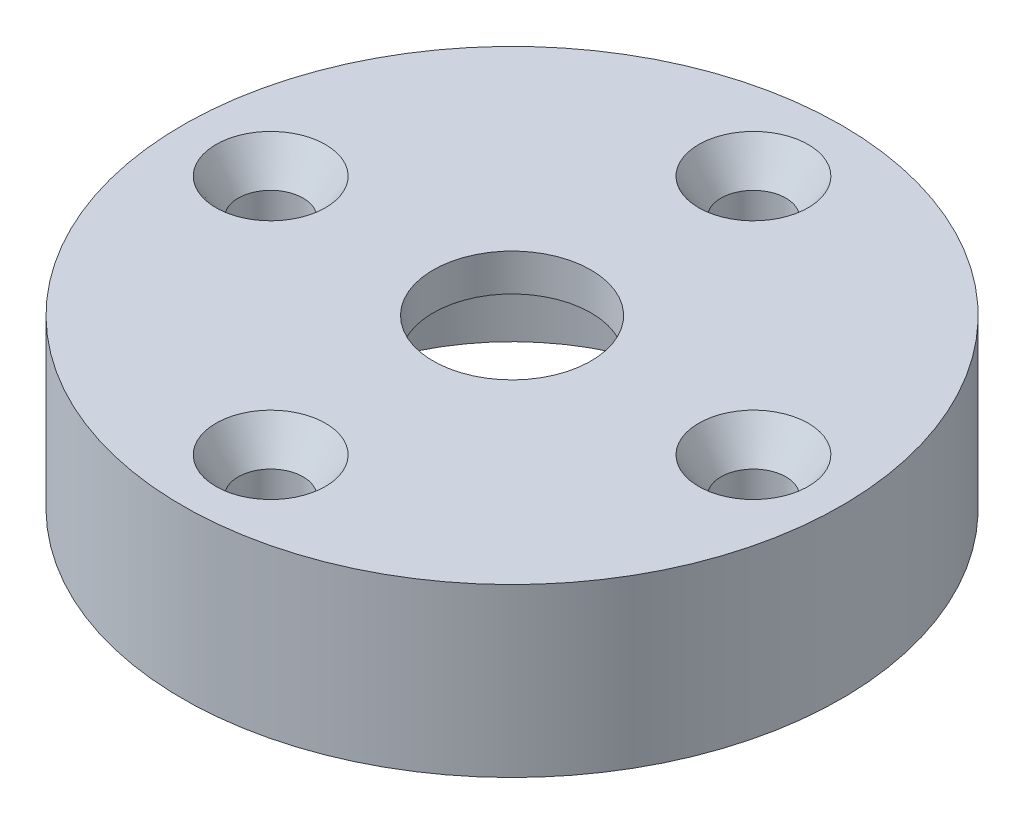
ISO-10303-21;
HEADER;
FILE_DESCRIPTION(('STEP AP214'),'2;1');
FILE_NAME('part.step','',(''),(''),'','','');
FILE_SCHEMA(('AUTOMOTIVE_DESIGN { 1 0 10303 214 1 1 1 1 }'));
ENDSEC;
DATA;
#1=APPLICATION_CONTEXT('core data for automotive mechanical design processes');
#2=APPLICATION_PROTOCOL_DEFINITION('international standard','automotive_design',2000,#1);
#3=PRODUCT_CONTEXT('',#1,'mechanical');
#4=PRODUCT('Part','Part','',(#3));
#5=PRODUCT_RELATED_PRODUCT_CATEGORY('part','',(#4));
#6=PRODUCT_DEFINITION_FORMATION('','',#4);
#7=PRODUCT_DEFINITION_CONTEXT('part definition',#1,'design');
#8=PRODUCT_DEFINITION('design','',#6,#7);
#9=PRODUCT_DEFINITION_SHAPE('','',#8);
#10=(LENGTH_UNIT() NAMED_UNIT(*) SI_UNIT(.MILLI.,.METRE.));
#11=(NAMED_UNIT(*) PLANE_ANGLE_UNIT() SI_UNIT($,.RADIAN.));
#12=(NAMED_UNIT(*) SI_UNIT($,.STERADIAN.) SOLID_ANGLE_UNIT());
#13=UNCERTAINTY_MEASURE_WITH_UNIT(LENGTH_MEASURE(1.E-05),#10,'distance_accuracy_value','');
#14=(GEOMETRIC_REPRESENTATION_CONTEXT(3) GLOBAL_UNCERTAINTY_ASSIGNED_CONTEXT((#13)) GLOBAL_UNIT_ASSIGNED_CONTEXT((#10,
#11,#12)) REPRESENTATION_CONTEXT('',''));
#15=CARTESIAN_POINT('',(0.,0.,0.));
#16=DIRECTION('',(0.,0.,1.));
#17=DIRECTION('',(1.,0.,0.));
#18=AXIS2_PLACEMENT_3D('',#15,#16,#17);
#19=CARTESIAN_POINT('',(0.,0.,0.));
#20=DIRECTION('',(0.,-1.,0.));
#21=DIRECTION('',(0.,0.,-1.));
#22=AXIS2_PLACEMENT_3D('',#19,#20,#21);
#23=CYLINDRICAL_SURFACE('',#22,11.);
#24=CARTESIAN_POINT('',(0.,7.,0.));
#25=DIRECTION('',(0.,-1.,0.));
#26=DIRECTION('',(0.,0.,-1.));
#27=AXIS2_PLACEMENT_3D('',#24,#25,#26);
#28=CIRCLE('',#27,11.);
#29=CARTESIAN_POINT('',(0.,7.,-11.));
#30=VERTEX_POINT('',#29);
#31=EDGE_CURVE('E84',#30,#30,#28,.T.);
#32=ORIENTED_EDGE('',*,*,#31,.F.);
#33=EDGE_LOOP('',(#32));
#34=FACE_BOUND('',#33,.T.);
#35=CARTESIAN_POINT('',(0.,0.,0.));
#36=DIRECTION('',(0.,-1.,0.));
#37=DIRECTION('',(0.,0.,-1.));
#38=AXIS2_PLACEMENT_3D('',#35,#36,#37);
#39=CIRCLE('',#38,11.);
#40=CARTESIAN_POINT('',(0.,0.,-11.));
#41=VERTEX_POINT('',#40);
#42=EDGE_CURVE('E69',#41,#41,#39,.T.);
#43=ORIENTED_EDGE('',*,*,#42,.T.);
#44=EDGE_LOOP('',(#43));
#45=FACE_BOUND('',#44,.T.);
#46=ADVANCED_FACE('F36',(#34,#45),#23,.F.);
#47=CARTESIAN_POINT('',(-11.,0.,0.));
#48=DIRECTION('',(0.,1.,0.));
#49=DIRECTION('',(0.,0.,1.));
#50=AXIS2_PLACEMENT_3D('',#47,#48,#49);
#51=PLANE('',#50);
#52=CARTESIAN_POINT('',(0.,0.,-13.));
#53=DIRECTION('',(0.,1.,0.));
#54=DIRECTION('',(0.,0.,1.));
#55=AXIS2_PLACEMENT_3D('',#52,#53,#54);
#56=CIRCLE('',#55,1.75);
#57=CARTESIAN_POINT('',(0.,0.,-11.25));
#58=VERTEX_POINT('',#57);
#59=EDGE_CURVE('E87',#58,#58,#56,.F.);
#60=ORIENTED_EDGE('',*,*,#59,.F.);
#61=EDGE_LOOP('',(#60));
#62=FACE_BOUND('',#61,.T.);
#63=CARTESIAN_POINT('',(13.,0.,0.));
#64=DIRECTION('',(0.,1.,0.));
#65=DIRECTION('',(0.,0.,1.));
#66=AXIS2_PLACEMENT_3D('',#63,#64,#65);
#67=CIRCLE('',#66,1.75000000000046);
#68=CARTESIAN_POINT('',(13.,0.,1.75000000000046));
#69=VERTEX_POINT('',#68);
#70=EDGE_CURVE('E94',#69,#69,#67,.F.);
#71=ORIENTED_EDGE('',*,*,#70,.F.);
#72=EDGE_LOOP('',(#71));
#73=FACE_BOUND('',#72,.T.);
#74=CARTESIAN_POINT('',(0.,0.,13.));
#75=DIRECTION('',(0.,1.,0.));
#76=DIRECTION('',(0.,0.,1.));
#77=AXIS2_PLACEMENT_3D('',#74,#75,#76);
#78=CIRCLE('',#77,1.7500000000007);
#79=CARTESIAN_POINT('',(0.,0.,14.7500000000007));
#80=VERTEX_POINT('',#79);
#81=EDGE_CURVE('E91',#80,#80,#78,.F.);
#82=ORIENTED_EDGE('',*,*,#81,.F.);
#83=EDGE_LOOP('',(#82));
#84=FACE_BOUND('',#83,.T.);
#85=CARTESIAN_POINT('',(-13.,0.,0.));
#86=DIRECTION('',(0.,1.,0.));
#87=DIRECTION('',(0.,0.,1.));
#88=AXIS2_PLACEMENT_3D('',#85,#86,#87);
#89=CIRCLE('',#88,1.75000000000024);
#90=CARTESIAN_POINT('',(-13.,0.,1.75000000000024));
#91=VERTEX_POINT('',#90);
#92=EDGE_CURVE('E88',#91,#91,#89,.F.);
#93=ORIENTED_EDGE('',*,*,#92,.F.);
#94=EDGE_LOOP('',(#93));
#95=FACE_BOUND('',#94,.T.);
#96=ORIENTED_EDGE('',*,*,#42,.F.);
#97=EDGE_LOOP('',(#96));
#98=FACE_BOUND('',#97,.T.);
#99=CARTESIAN_POINT('',(0.,0.,0.));
#100=DIRECTION('',(0.,-1.,0.));
#101=DIRECTION('',(0.,0.,-1.));
#102=AXIS2_PLACEMENT_3D('',#99,#100,#101);
#103=CIRCLE('',#102,17.75);
#104=CARTESIAN_POINT('',(0.,0.,-17.75));
#105=VERTEX_POINT('',#104);
#106=EDGE_CURVE('E72',#105,#105,#103,.T.);
#107=ORIENTED_EDGE('',*,*,#106,.T.);
#108=EDGE_LOOP('',(#107));
#109=FACE_BOUND('',#108,.T.);
#110=ADVANCED_FACE('F102',(#62,#73,#84,#95,#98,#109),#51,.F.);
#111=CARTESIAN_POINT('',(0.,0.,0.));
#112=DIRECTION('',(0.,-1.,0.));
#113=DIRECTION('',(0.,0.,-1.));
#114=AXIS2_PLACEMENT_3D('',#111,#112,#113);
#115=CYLINDRICAL_SURFACE('',#114,17.75);
#116=ORIENTED_EDGE('',*,*,#106,.F.);
#117=EDGE_LOOP('',(#116));
#118=FACE_BOUND('',#117,.T.);
#119=CARTESIAN_POINT('',(0.,9.,0.));
#120=DIRECTION('',(0.,-1.,0.));
#121=DIRECTION('',(0.,0.,-1.));
#122=AXIS2_PLACEMENT_3D('',#119,#120,#121);
#123=CIRCLE('',#122,17.75);
#124=CARTESIAN_POINT('',(0.,9.,-17.75));
#125=VERTEX_POINT('',#124);
#126=EDGE_CURVE('E75',#125,#125,#123,.T.);
#127=ORIENTED_EDGE('',*,*,#126,.T.);
#128=EDGE_LOOP('',(#127));
#129=FACE_BOUND('',#128,.T.);
#130=ADVANCED_FACE('F105',(#118,#129),#115,.T.);
#131=CARTESIAN_POINT('',(-17.75,9.,0.));
#132=DIRECTION('',(0.,-1.,0.));
#133=DIRECTION('',(0.,0.,-1.));
#134=AXIS2_PLACEMENT_3D('',#131,#132,#133);
#135=PLANE('',#134);
#136=CARTESIAN_POINT('',(0.,9.,13.));
#137=DIRECTION('',(0.,-1.,0.));
#138=DIRECTION('',(0.,0.,-1.));
#139=AXIS2_PLACEMENT_3D('',#136,#137,#138);
#140=CIRCLE('',#139,2.9500000000007);
#141=CARTESIAN_POINT('',(0.,9.,15.9500000000007));
#142=VERTEX_POINT('',#141);
#143=EDGE_CURVE('E52',#142,#142,#140,.T.);
#144=ORIENTED_EDGE('',*,*,#143,.T.);
#145=EDGE_LOOP('',(#144));
#146=FACE_BOUND('',#145,.T.);
#147=CARTESIAN_POINT('',(13.,9.,0.));
#148=DIRECTION('',(0.,-1.,0.));
#149=DIRECTION('',(0.,0.,-1.));
#150=AXIS2_PLACEMENT_3D('',#147,#148,#149);
#151=CIRCLE('',#150,2.95000000000047);
#152=CARTESIAN_POINT('',(13.,9.,-2.95000000000047));
#153=VERTEX_POINT('',#152);
#154=EDGE_CURVE('E57',#153,#153,#151,.T.);
#155=ORIENTED_EDGE('',*,*,#154,.T.);
#156=EDGE_LOOP('',(#155));
#157=FACE_BOUND('',#156,.T.);
#158=CARTESIAN_POINT('',(0.,9.,-13.));
#159=DIRECTION('',(0.,-1.,0.));
#160=DIRECTION('',(0.,0.,-1.));
#161=AXIS2_PLACEMENT_3D('',#158,#159,#160);
#162=CIRCLE('',#161,2.95);
#163=CARTESIAN_POINT('',(0.,9.,-10.05));
#164=VERTEX_POINT('',#163);
#165=EDGE_CURVE('E60',#164,#164,#162,.T.);
#166=ORIENTED_EDGE('',*,*,#165,.T.);
#167=EDGE_LOOP('',(#166));
#168=FACE_BOUND('',#167,.T.);
#169=CARTESIAN_POINT('',(-13.,9.,0.));
#170=DIRECTION('',(0.,-1.,0.));
#171=DIRECTION('',(0.,0.,-1.));
#172=AXIS2_PLACEMENT_3D('',#169,#170,#171);
#173=CIRCLE('',#172,2.95000000000025);
#174=CARTESIAN_POINT('',(-13.,9.,-2.95000000000025));
#175=VERTEX_POINT('',#174);
#176=EDGE_CURVE('E63',#175,#175,#173,.T.);
#177=ORIENTED_EDGE('',*,*,#176,.T.);
#178=EDGE_LOOP('',(#177));
#179=FACE_BOUND('',#178,.T.);
#180=ORIENTED_EDGE('',*,*,#126,.F.);
#181=EDGE_LOOP('',(#180));
#182=FACE_BOUND('',#181,.T.);
#183=CARTESIAN_POINT('',(0.,9.,0.));
#184=DIRECTION('',(0.,-1.,0.));
#185=DIRECTION('',(0.,0.,-1.));
#186=AXIS2_PLACEMENT_3D('',#183,#184,#185);
#187=CIRCLE('',#186,4.25);
#188=CARTESIAN_POINT('',(0.,9.,-4.25));
#189=VERTEX_POINT('',#188);
#190=EDGE_CURVE('E78',#189,#189,#187,.T.);
#191=ORIENTED_EDGE('',*,*,#190,.T.);
#192=EDGE_LOOP('',(#191));
#193=FACE_BOUND('',#192,.T.);
#194=ADVANCED_FACE('F119',(#146,#157,#168,#179,#182,#193),#135,.F.);
#195=CARTESIAN_POINT('',(0.,0.,0.));
#196=DIRECTION('',(0.,-1.,0.));
#197=DIRECTION('',(0.,0.,-1.));
#198=AXIS2_PLACEMENT_3D('',#195,#196,#197);
#199=CYLINDRICAL_SURFACE('',#198,4.25);
#200=ORIENTED_EDGE('',*,*,#190,.F.);
#201=EDGE_LOOP('',(#200));
#202=FACE_BOUND('',#201,.T.);
#203=CARTESIAN_POINT('',(0.,7.,0.));
#204=DIRECTION('',(0.,-1.,0.));
#205=DIRECTION('',(0.,0.,-1.));
#206=AXIS2_PLACEMENT_3D('',#203,#204,#205);
#207=CIRCLE('',#206,4.25);
#208=CARTESIAN_POINT('',(0.,7.,-4.25));
#209=VERTEX_POINT('',#208);
#210=EDGE_CURVE('E81',#209,#209,#207,.T.);
#211=ORIENTED_EDGE('',*,*,#210,.T.);
#212=EDGE_LOOP('',(#211));
#213=FACE_BOUND('',#212,.T.);
#214=ADVANCED_FACE('F125',(#202,#213),#199,.F.);
#215=CARTESIAN_POINT('',(-4.25,7.,0.));
#216=DIRECTION('',(0.,1.,0.));
#217=DIRECTION('',(0.,0.,1.));
#218=AXIS2_PLACEMENT_3D('',#215,#216,#217);
#219=PLANE('',#218);
#220=ORIENTED_EDGE('',*,*,#210,.F.);
#221=EDGE_LOOP('',(#220));
#222=FACE_BOUND('',#221,.T.);
#223=ORIENTED_EDGE('',*,*,#31,.T.);
#224=EDGE_LOOP('',(#223));
#225=FACE_BOUND('',#224,.T.);
#226=ADVANCED_FACE('F132',(#222,#225),#219,.F.);
#227=CARTESIAN_POINT('',(-13.,-4.94974746830781,0.));
#228=DIRECTION('',(0.,1.,0.));
#229=DIRECTION('',(0.,0.,1.));
#230=AXIS2_PLACEMENT_3D('',#227,#228,#229);
#231=CYLINDRICAL_SURFACE('',#230,1.75000000000024);
#232=CARTESIAN_POINT('',(-13.,7.09999999999998,0.));
#233=DIRECTION('',(0.,-1.,0.));
#234=DIRECTION('',(0.,0.,-1.));
#235=AXIS2_PLACEMENT_3D('',#232,#233,#234);
#236=CIRCLE('',#235,1.75000000000024);
#237=CARTESIAN_POINT('',(-13.,7.09999999999998,-1.75000000000024));
#238=VERTEX_POINT('',#237);
#239=EDGE_CURVE('E10',#238,#238,#236,.F.);
#240=ORIENTED_EDGE('',*,*,#239,.T.);
#241=EDGE_LOOP('',(#240));
#242=FACE_BOUND('',#241,.T.);
#243=ORIENTED_EDGE('',*,*,#92,.T.);
#244=EDGE_LOOP('',(#243));
#245=FACE_BOUND('',#244,.T.);
#246=ADVANCED_FACE('F138',(#242,#245),#231,.F.);
#247=CARTESIAN_POINT('',(0.,-4.94974746830781,13.));
#248=DIRECTION('',(0.,1.,0.));
#249=DIRECTION('',(0.,0.,1.));
#250=AXIS2_PLACEMENT_3D('',#247,#248,#249);
#251=CYLINDRICAL_SURFACE('',#250,1.7500000000007);
#252=CARTESIAN_POINT('',(0.,7.09999999999999,13.));
#253=DIRECTION('',(0.,-1.,0.));
#254=DIRECTION('',(0.,0.,-1.));
#255=AXIS2_PLACEMENT_3D('',#252,#253,#254);
#256=CIRCLE('',#255,1.7500000000007);
#257=CARTESIAN_POINT('',(0.,7.09999999999999,14.7500000000007));
#258=VERTEX_POINT('',#257);
#259=EDGE_CURVE('E66',#258,#258,#256,.F.);
#260=ORIENTED_EDGE('',*,*,#259,.T.);
#261=EDGE_LOOP('',(#260));
#262=FACE_BOUND('',#261,.T.);
#263=ORIENTED_EDGE('',*,*,#81,.T.);
#264=EDGE_LOOP('',(#263));
#265=FACE_BOUND('',#264,.T.);
#266=ADVANCED_FACE('F213',(#262,#265),#251,.F.);
#267=CARTESIAN_POINT('',(13.,-4.94974746830781,0.));
#268=DIRECTION('',(0.,1.,0.));
#269=DIRECTION('',(0.,0.,1.));
#270=AXIS2_PLACEMENT_3D('',#267,#268,#269);
#271=CYLINDRICAL_SURFACE('',#270,1.75000000000046);
#272=CARTESIAN_POINT('',(13.,7.09999999999997,0.));
#273=DIRECTION('',(0.,-1.,0.));
#274=DIRECTION('',(0.,0.,-1.));
#275=AXIS2_PLACEMENT_3D('',#272,#273,#274);
#276=CIRCLE('',#275,1.75000000000046);
#277=CARTESIAN_POINT('',(13.,7.09999999999997,-1.75000000000045));
#278=VERTEX_POINT('',#277);
#279=EDGE_CURVE('E48',#278,#278,#276,.F.);
#280=ORIENTED_EDGE('',*,*,#279,.T.);
#281=EDGE_LOOP('',(#280));
#282=FACE_BOUND('',#281,.T.);
#283=ORIENTED_EDGE('',*,*,#70,.T.);
#284=EDGE_LOOP('',(#283));
#285=FACE_BOUND('',#284,.T.);
#286=ADVANCED_FACE('F204',(#282,#285),#271,.F.);
#287=CARTESIAN_POINT('',(0.,-4.94974746830781,-13.));
#288=DIRECTION('',(0.,1.,0.));
#289=DIRECTION('',(0.,0.,1.));
#290=AXIS2_PLACEMENT_3D('',#287,#288,#289);
#291=CYLINDRICAL_SURFACE('',#290,1.75);
#292=CARTESIAN_POINT('',(0.,7.09999999999999,-13.));
#293=DIRECTION('',(0.,-1.,0.));
#294=DIRECTION('',(0.,0.,-1.));
#295=AXIS2_PLACEMENT_3D('',#292,#293,#294);
#296=CIRCLE('',#295,1.75);
#297=CARTESIAN_POINT('',(0.,7.09999999999999,-11.25));
#298=VERTEX_POINT('',#297);
#299=EDGE_CURVE('E44',#298,#298,#296,.F.);
#300=ORIENTED_EDGE('',*,*,#299,.T.);
#301=EDGE_LOOP('',(#300));
#302=FACE_BOUND('',#301,.T.);
#303=ORIENTED_EDGE('',*,*,#59,.T.);
#304=EDGE_LOOP('',(#303));
#305=FACE_BOUND('',#304,.T.);
#306=ADVANCED_FACE('F100',(#302,#305),#291,.F.);
#307=CARTESIAN_POINT('',(0.,7.09999999999999,13.));
#308=DIRECTION('',(0.,1.,0.));
#309=DIRECTION('',(0.,0.,1.));
#310=AXIS2_PLACEMENT_3D('',#307,#308,#309);
#311=CONICAL_SURFACE('',#310,1.7500000000007,0.563316261491968);
#312=CARTESIAN_POINT('',(0.,9.,15.9500000000007));
#313=CARTESIAN_POINT('',(0.,8.98020833333334,15.9375000000007));
#314=CARTESIAN_POINT('',(0.,8.96041666666667,15.9250000000007));
#315=CARTESIAN_POINT('',(0.,8.92083333333334,15.9000000000007));
#316=CARTESIAN_POINT('',(0.,8.90104166666667,15.8875000000007));
#317=CARTESIAN_POINT('',(0.,8.86145833333333,15.8625000000007));
#318=CARTESIAN_POINT('',(0.,8.84166666666667,15.8500000000007));
#319=CARTESIAN_POINT('',(0.,8.80208333333334,15.8250000000007));
#320=CARTESIAN_POINT('',(0.,8.78229166666667,15.8125000000007));
#321=CARTESIAN_POINT('',(0.,8.74270833333333,15.7875000000007));
#322=CARTESIAN_POINT('',(0.,8.72291666666667,15.7750000000007));
#323=CARTESIAN_POINT('',(0.,8.68333333333334,15.7500000000007));
#324=CARTESIAN_POINT('',(0.,8.66354166666667,15.7375000000007));
#325=CARTESIAN_POINT('',(0.,8.62395833333333,15.7125000000007));
#326=CARTESIAN_POINT('',(0.,8.60416666666667,15.7000000000007));
#327=CARTESIAN_POINT('',(0.,8.56458333333333,15.6750000000007));
#328=CARTESIAN_POINT('',(0.,8.54479166666667,15.6625000000007));
#329=CARTESIAN_POINT('',(0.,8.50520833333333,15.6375000000007));
#330=CARTESIAN_POINT('',(0.,8.48541666666667,15.6250000000007));
#331=CARTESIAN_POINT('',(0.,8.44583333333333,15.6000000000007));
#332=CARTESIAN_POINT('',(0.,8.42604166666666,15.5875000000007));
#333=CARTESIAN_POINT('',(0.,8.38645833333333,15.5625000000007));
#334=CARTESIAN_POINT('',(0.,8.36666666666667,15.5500000000007));
#335=CARTESIAN_POINT('',(0.,8.32708333333333,15.5250000000007));
#336=CARTESIAN_POINT('',(0.,8.30729166666666,15.5125000000007));
#337=CARTESIAN_POINT('',(0.,8.26770833333333,15.4875000000007));
#338=CARTESIAN_POINT('',(0.,8.24791666666666,15.4750000000007));
#339=CARTESIAN_POINT('',(0.,8.20833333333333,15.4500000000007));
#340=CARTESIAN_POINT('',(0.,8.18854166666666,15.4375000000007));
#341=CARTESIAN_POINT('',(0.,8.14895833333333,15.4125000000007));
#342=CARTESIAN_POINT('',(0.,8.12916666666666,15.4000000000007));
#343=CARTESIAN_POINT('',(0.,8.08958333333333,15.3750000000007));
#344=CARTESIAN_POINT('',(0.,8.06979166666666,15.3625000000007));
#345=CARTESIAN_POINT('',(0.,8.03020833333333,15.3375000000007));
#346=CARTESIAN_POINT('',(0.,8.01041666666666,15.3250000000007));
#347=CARTESIAN_POINT('',(0.,7.97083333333333,15.3000000000007));
#348=CARTESIAN_POINT('',(0.,7.95104166666666,15.2875000000007));
#349=CARTESIAN_POINT('',(0.,7.91145833333333,15.2625000000007));
#350=CARTESIAN_POINT('',(0.,7.89166666666666,15.2500000000007));
#351=CARTESIAN_POINT('',(0.,7.85208333333333,15.2250000000007));
#352=CARTESIAN_POINT('',(0.,7.83229166666666,15.2125000000007));
#353=CARTESIAN_POINT('',(0.,7.79270833333333,15.1875000000007));
#354=CARTESIAN_POINT('',(0.,7.77291666666666,15.1750000000007));
#355=CARTESIAN_POINT('',(0.,7.73333333333333,15.1500000000007));
#356=CARTESIAN_POINT('',(0.,7.71354166666666,15.1375000000007));
#357=CARTESIAN_POINT('',(0.,7.67395833333333,15.1125000000007));
#358=CARTESIAN_POINT('',(0.,7.65416666666666,15.1000000000007));
#359=CARTESIAN_POINT('',(0.,7.61458333333333,15.0750000000007));
#360=CARTESIAN_POINT('',(0.,7.59479166666666,15.0625000000007));
#361=CARTESIAN_POINT('',(0.,7.55520833333333,15.0375000000007));
#362=CARTESIAN_POINT('',(0.,7.53541666666666,15.0250000000007));
#363=CARTESIAN_POINT('',(0.,7.49583333333333,15.0000000000007));
#364=CARTESIAN_POINT('',(0.,7.47604166666666,14.9875000000007));
#365=CARTESIAN_POINT('',(0.,7.43645833333333,14.9625000000007));
#366=CARTESIAN_POINT('',(0.,7.41666666666666,14.9500000000007));
#367=CARTESIAN_POINT('',(0.,7.37708333333333,14.9250000000007));
#368=CARTESIAN_POINT('',(0.,7.35729166666666,14.9125000000007));
#369=CARTESIAN_POINT('',(0.,7.31770833333332,14.8875000000007));
#370=CARTESIAN_POINT('',(0.,7.29791666666666,14.8750000000007));
#371=CARTESIAN_POINT('',(0.,7.25833333333332,14.8500000000007));
#372=CARTESIAN_POINT('',(0.,7.23854166666666,14.8375000000007));
#373=CARTESIAN_POINT('',(0.,7.19895833333332,14.8125000000007));
#374=CARTESIAN_POINT('',(0.,7.17916666666666,14.8000000000007));
#375=CARTESIAN_POINT('',(0.,7.13958333333332,14.7750000000007));
#376=CARTESIAN_POINT('',(0.,7.11979166666666,14.7625000000007));
#377=CARTESIAN_POINT('',(0.,7.09999999999999,14.7500000000007));
#378=B_SPLINE_CURVE_WITH_KNOTS('',3,(#312,#313,#314,#315,#316,#317,#318,#319,#320,#321,#322,
#323,#324,#325,#326,#327,#328,#329,#330,#331,#332,#333,#334,#335,#336,#337,#338,#339,#340,#341,
#342,#343,#344,#345,#346,#347,#348,#349,#350,#351,#352,#353,#354,#355,#356,#357,#358,#359,#360,
#361,#362,#363,#364,#365,#366,#367,#368,#369,#370,#371,#372,#373,#374,#375,#376,#377),
.UNSPECIFIED.,.F.,.F.,(4,2,2,2,2,2,2,2,2,2,2,2,2,2,2,2,2,2,2,2,2,2,2,2,2,2,2,2,2,2,2,2,4),(0.,
0.0702256407945132,0.140451281589028,0.210676922383541,0.280902563178055,0.35112820397257,
0.421353844767083,0.491579485561596,0.561805126356109,0.632030767150624,0.702256407945138,
0.772482048739651,0.842707689534165,0.912933330328678,0.983158971123192,1.05338461191771,
1.12361025271222,1.19383589350673,1.26406153430125,1.33428717509576,1.40451281589027,
1.47473845668479,1.5449640974793,1.61518973827381,1.68541537906833,1.75564101986284,
1.82586666065736,1.89609230145187,1.96631794224638,2.0365435830409,2.10676922383541,
2.17699486462993,2.24722050542444),.UNSPECIFIED.);
#379=EDGE_CURVE('BSEAM149',#142,#258,#378,.T.);
#380=ORIENTED_EDGE('',*,*,#143,.F.);
#381=ORIENTED_EDGE('',*,*,#259,.F.);
#382=ORIENTED_EDGE('',*,*,#379,.T.);
#383=ORIENTED_EDGE('',*,*,#379,.F.);
#384=EDGE_LOOP('',(#380,#382,#381,#383));
#385=FACE_BOUND('',#384,.T.);
#386=ADVANCED_FACE('F149',(#385),#311,.F.);
#387=CARTESIAN_POINT('',(13.,7.09999999999997,0.));
#388=DIRECTION('',(0.,1.,0.));
#389=DIRECTION('',(0.,0.,1.));
#390=AXIS2_PLACEMENT_3D('',#387,#388,#389);
#391=CONICAL_SURFACE('',#390,1.75000000000046,0.563316261491968);
#392=ORIENTED_EDGE('',*,*,#154,.F.);
#393=EDGE_LOOP('',(#392));
#394=FACE_BOUND('',#393,.T.);
#395=ORIENTED_EDGE('',*,*,#279,.F.);
#396=EDGE_LOOP('',(#395));
#397=FACE_BOUND('',#396,.T.);
#398=ADVANCED_FACE('F155',(#394,#397),#391,.F.);
#399=CARTESIAN_POINT('',(0.,7.09999999999999,-13.));
#400=DIRECTION('',(0.,1.,0.));
#401=DIRECTION('',(0.,0.,1.));
#402=AXIS2_PLACEMENT_3D('',#399,#400,#401);
#403=CONICAL_SURFACE('',#402,1.75,0.563316261491966);
#404=CARTESIAN_POINT('',(0.,9.,-10.05));
#405=CARTESIAN_POINT('',(0.,8.98020833333334,-10.0625));
#406=CARTESIAN_POINT('',(0.,8.96041666666667,-10.075));
#407=CARTESIAN_POINT('',(0.,8.92083333333334,-10.1));
#408=CARTESIAN_POINT('',(0.,8.90104166666667,-10.1125));
#409=CARTESIAN_POINT('',(0.,8.86145833333333,-10.1375));
#410=CARTESIAN_POINT('',(0.,8.84166666666667,-10.15));
#411=CARTESIAN_POINT('',(0.,8.80208333333334,-10.175));
#412=CARTESIAN_POINT('',(0.,8.78229166666667,-10.1875));
#413=CARTESIAN_POINT('',(0.,8.74270833333333,-10.2125));
#414=CARTESIAN_POINT('',(0.,8.72291666666667,-10.225));
#415=CARTESIAN_POINT('',(0.,8.68333333333334,-10.25));
#416=CARTESIAN_POINT('',(0.,8.66354166666667,-10.2625));
#417=CARTESIAN_POINT('',(0.,8.62395833333333,-10.2875));
#418=CARTESIAN_POINT('',(0.,8.60416666666667,-10.3));
#419=CARTESIAN_POINT('',(0.,8.56458333333333,-10.325));
#420=CARTESIAN_POINT('',(0.,8.54479166666667,-10.3375));
#421=CARTESIAN_POINT('',(0.,8.50520833333333,-10.3625));
#422=CARTESIAN_POINT('',(0.,8.48541666666667,-10.375));
#423=CARTESIAN_POINT('',(0.,8.44583333333333,-10.4));
#424=CARTESIAN_POINT('',(0.,8.42604166666666,-10.4125));
#425=CARTESIAN_POINT('',(0.,8.38645833333333,-10.4375));
#426=CARTESIAN_POINT('',(0.,8.36666666666667,-10.45));
#427=CARTESIAN_POINT('',(0.,8.32708333333333,-10.475));
#428=CARTESIAN_POINT('',(0.,8.30729166666666,-10.4875));
#429=CARTESIAN_POINT('',(0.,8.26770833333333,-10.5125));
#430=CARTESIAN_POINT('',(0.,8.24791666666666,-10.525));
#431=CARTESIAN_POINT('',(0.,8.20833333333333,-10.55));
#432=CARTESIAN_POINT('',(0.,8.18854166666666,-10.5625));
#433=CARTESIAN_POINT('',(0.,8.14895833333333,-10.5875));
#434=CARTESIAN_POINT('',(0.,8.12916666666666,-10.6));
#435=CARTESIAN_POINT('',(0.,8.08958333333333,-10.625));
#436=CARTESIAN_POINT('',(0.,8.06979166666666,-10.6375));
#437=CARTESIAN_POINT('',(0.,8.03020833333333,-10.6625));
#438=CARTESIAN_POINT('',(0.,8.01041666666666,-10.675));
#439=CARTESIAN_POINT('',(0.,7.97083333333333,-10.7));
#440=CARTESIAN_POINT('',(0.,7.95104166666666,-10.7125));
#441=CARTESIAN_POINT('',(0.,7.91145833333333,-10.7375));
#442=CARTESIAN_POINT('',(0.,7.89166666666666,-10.75));
#443=CARTESIAN_POINT('',(0.,7.85208333333333,-10.775));
#444=CARTESIAN_POINT('',(0.,7.83229166666666,-10.7875));
#445=CARTESIAN_POINT('',(0.,7.79270833333333,-10.8125));
#446=CARTESIAN_POINT('',(0.,7.77291666666666,-10.825));
#447=CARTESIAN_POINT('',(0.,7.73333333333333,-10.85));
#448=CARTESIAN_POINT('',(0.,7.71354166666666,-10.8625));
#449=CARTESIAN_POINT('',(0.,7.67395833333333,-10.8875));
#450=CARTESIAN_POINT('',(0.,7.65416666666666,-10.9));
#451=CARTESIAN_POINT('',(0.,7.61458333333333,-10.925));
#452=CARTESIAN_POINT('',(0.,7.59479166666666,-10.9375));
#453=CARTESIAN_POINT('',(0.,7.55520833333333,-10.9625));
#454=CARTESIAN_POINT('',(0.,7.53541666666666,-10.975));
#455=CARTESIAN_POINT('',(0.,7.49583333333333,-11.));
#456=CARTESIAN_POINT('',(0.,7.47604166666666,-11.0125));
#457=CARTESIAN_POINT('',(0.,7.43645833333333,-11.0375));
#458=CARTESIAN_POINT('',(0.,7.41666666666666,-11.05));
#459=CARTESIAN_POINT('',(0.,7.37708333333333,-11.075));
#460=CARTESIAN_POINT('',(0.,7.35729166666666,-11.0875));
#461=CARTESIAN_POINT('',(0.,7.31770833333332,-11.1125));
#462=CARTESIAN_POINT('',(0.,7.29791666666666,-11.125));
#463=CARTESIAN_POINT('',(0.,7.25833333333332,-11.15));
#464=CARTESIAN_POINT('',(0.,7.23854166666666,-11.1625));
#465=CARTESIAN_POINT('',(0.,7.19895833333332,-11.1875));
#466=CARTESIAN_POINT('',(0.,7.17916666666666,-11.2));
#467=CARTESIAN_POINT('',(0.,7.13958333333332,-11.225));
#468=CARTESIAN_POINT('',(0.,7.11979166666666,-11.2375));
#469=CARTESIAN_POINT('',(0.,7.09999999999999,-11.25));
#470=B_SPLINE_CURVE_WITH_KNOTS('',3,(#404,#405,#406,#407,#408,#409,#410,#411,#412,#413,#414,
#415,#416,#417,#418,#419,#420,#421,#422,#423,#424,#425,#426,#427,#428,#429,#430,#431,#432,#433,
#434,#435,#436,#437,#438,#439,#440,#441,#442,#443,#444,#445,#446,#447,#448,#449,#450,#451,#452,
#453,#454,#455,#456,#457,#458,#459,#460,#461,#462,#463,#464,#465,#466,#467,#468,#469),
.UNSPECIFIED.,.F.,.F.,(4,2,2,2,2,2,2,2,2,2,2,2,2,2,2,2,2,2,2,2,2,2,2,2,2,2,2,2,2,2,2,2,4),(0.,
0.0702256407945132,0.140451281589026,0.210676922383541,0.280902563178054,0.351128203972568,
0.421353844767081,0.491579485561594,0.561805126356108,0.632030767150622,0.702256407945136,
0.772482048739649,0.842707689534162,0.912933330328676,0.983158971123191,1.0533846119177,
1.12361025271222,1.19383589350673,1.26406153430124,1.33428717509576,1.40451281589027,
1.47473845668478,1.5449640974793,1.61518973827381,1.68541537906833,1.75564101986284,
1.82586666065735,1.89609230145187,1.96631794224638,2.03654358304089,2.10676922383541,
2.17699486462992,2.24722050542443),.UNSPECIFIED.);
#471=EDGE_CURVE('BSEAM161',#164,#298,#470,.T.);
#472=ORIENTED_EDGE('',*,*,#165,.F.);
#473=ORIENTED_EDGE('',*,*,#299,.F.);
#474=ORIENTED_EDGE('',*,*,#471,.T.);
#475=ORIENTED_EDGE('',*,*,#471,.F.);
#476=EDGE_LOOP('',(#472,#474,#473,#475));
#477=FACE_BOUND('',#476,.T.);
#478=ADVANCED_FACE('F161',(#477),#403,.F.);
#479=CARTESIAN_POINT('',(-13.,7.09999999999998,0.));
#480=DIRECTION('',(0.,1.,0.));
#481=DIRECTION('',(0.,0.,1.));
#482=AXIS2_PLACEMENT_3D('',#479,#480,#481);
#483=CONICAL_SURFACE('',#482,1.75000000000024,0.563316261491965);
#484=ORIENTED_EDGE('',*,*,#176,.F.);
#485=EDGE_LOOP('',(#484));
#486=FACE_BOUND('',#485,.T.);
#487=ORIENTED_EDGE('',*,*,#239,.F.);
#488=EDGE_LOOP('',(#487));
#489=FACE_BOUND('',#488,.T.);
#490=ADVANCED_FACE('F39',(#486,#489),#483,.F.);
#491=CLOSED_SHELL('',(#46,#110,#130,#194,#214,#226,#246,#266,#286,#306,#386,#398,#478,#490));
#492=MANIFOLD_SOLID_BREP('B2',#491);
#493=ADVANCED_BREP_SHAPE_REPRESENTATION('',(#18,#492),#14);
#494=SHAPE_DEFINITION_REPRESENTATION(#9,#493);
ENDSEC;
END-ISO-10303-21;
